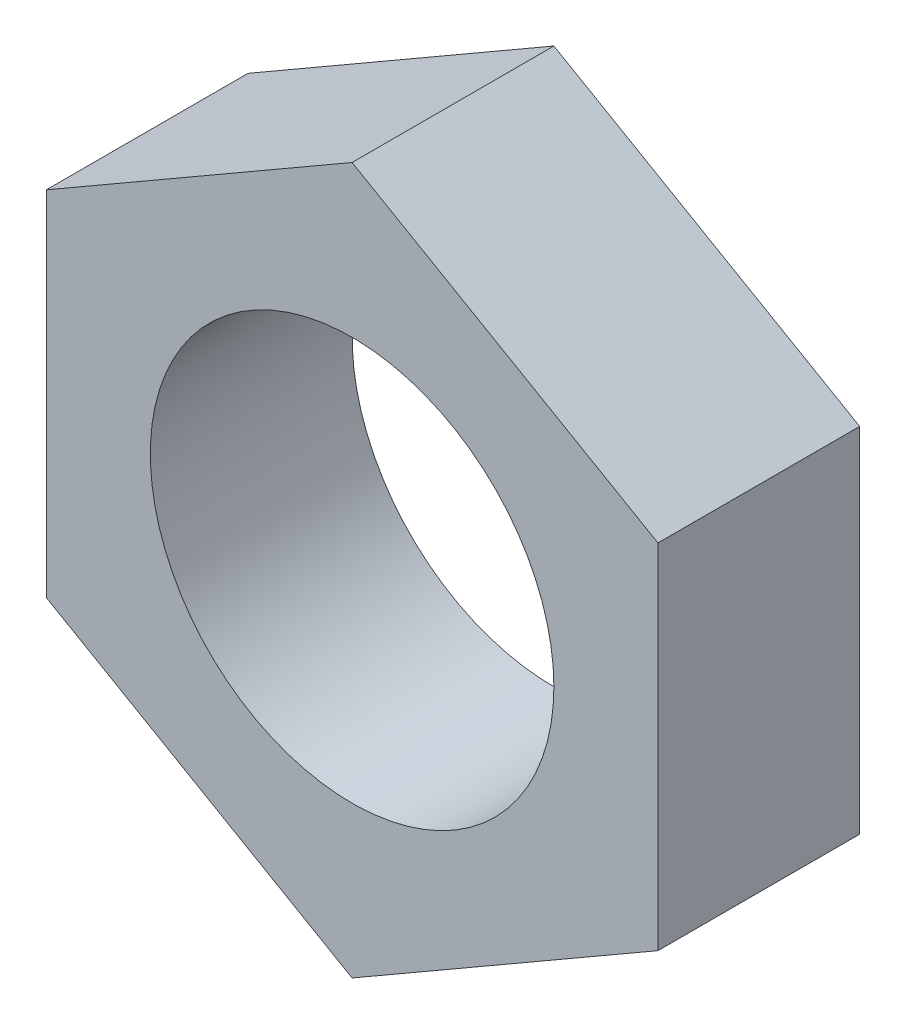
ISO-10303-21;
HEADER;
FILE_DESCRIPTION(('STEP AP214'),'2;1');
FILE_NAME('part.step','',(''),(''),'','','');
FILE_SCHEMA(('AUTOMOTIVE_DESIGN { 1 0 10303 214 1 1 1 1 }'));
ENDSEC;
DATA;
#1=APPLICATION_CONTEXT('core data for automotive mechanical design processes');
#2=APPLICATION_PROTOCOL_DEFINITION('international standard','automotive_design',2000,#1);
#3=PRODUCT_CONTEXT('',#1,'mechanical');
#4=PRODUCT('Part','Part','',(#3));
#5=PRODUCT_RELATED_PRODUCT_CATEGORY('part','',(#4));
#6=PRODUCT_DEFINITION_FORMATION('','',#4);
#7=PRODUCT_DEFINITION_CONTEXT('part definition',#1,'design');
#8=PRODUCT_DEFINITION('design','',#6,#7);
#9=PRODUCT_DEFINITION_SHAPE('','',#8);
#10=(LENGTH_UNIT() NAMED_UNIT(*) SI_UNIT(.MILLI.,.METRE.));
#11=(NAMED_UNIT(*) PLANE_ANGLE_UNIT() SI_UNIT($,.RADIAN.));
#12=(NAMED_UNIT(*) SI_UNIT($,.STERADIAN.) SOLID_ANGLE_UNIT());
#13=UNCERTAINTY_MEASURE_WITH_UNIT(LENGTH_MEASURE(1.E-05),#10,'distance_accuracy_value','');
#14=(GEOMETRIC_REPRESENTATION_CONTEXT(3) GLOBAL_UNCERTAINTY_ASSIGNED_CONTEXT((#13)) GLOBAL_UNIT_ASSIGNED_CONTEXT((#10,
#11,#12)) REPRESENTATION_CONTEXT('',''));
#15=CARTESIAN_POINT('',(0.,0.,0.));
#16=DIRECTION('',(0.,0.,1.));
#17=DIRECTION('',(1.,0.,0.));
#18=AXIS2_PLACEMENT_3D('',#15,#16,#17);
#19=CARTESIAN_POINT('',(0.,0.,2.));
#20=DIRECTION('',(0.,0.,1.));
#21=DIRECTION('',(1.,0.,0.));
#22=AXIS2_PLACEMENT_3D('',#19,#20,#21);
#23=PLANE('',#22);
#24=DIRECTION('',(-0.866025403784439,-0.5,0.));
#25=VECTOR('',#24,1.);
#26=CARTESIAN_POINT('',(0.,3.5,2.));
#27=LINE('',#26,#25);
#28=CARTESIAN_POINT('',(0.,3.5,2.));
#29=VERTEX_POINT('',#28);
#30=CARTESIAN_POINT('',(-3.03108891324554,1.75,2.));
#31=VERTEX_POINT('',#30);
#32=EDGE_CURVE('E128',#29,#31,#27,.T.);
#33=ORIENTED_EDGE('',*,*,#32,.T.);
#34=DIRECTION('',(0.,-1.,0.));
#35=VECTOR('',#34,1.);
#36=CARTESIAN_POINT('',(-3.03108891324554,1.75,2.));
#37=LINE('',#36,#35);
#38=CARTESIAN_POINT('',(-3.03108891324554,-1.75,2.));
#39=VERTEX_POINT('',#38);
#40=EDGE_CURVE('E86',#31,#39,#37,.T.);
#41=ORIENTED_EDGE('',*,*,#40,.T.);
#42=DIRECTION('',(0.866025403784438,-0.5,0.));
#43=VECTOR('',#42,1.);
#44=CARTESIAN_POINT('',(-3.03108891324554,-1.75,2.));
#45=LINE('',#44,#43);
#46=CARTESIAN_POINT('',(0.,-3.5,2.));
#47=VERTEX_POINT('',#46);
#48=EDGE_CURVE('E99',#39,#47,#45,.T.);
#49=ORIENTED_EDGE('',*,*,#48,.T.);
#50=DIRECTION('',(0.866025403784439,0.5,0.));
#51=VECTOR('',#50,1.);
#52=CARTESIAN_POINT('',(0.,-3.5,2.));
#53=LINE('',#52,#51);
#54=CARTESIAN_POINT('',(3.03108891324554,-1.75,2.));
#55=VERTEX_POINT('',#54);
#56=EDGE_CURVE('E93',#47,#55,#53,.T.);
#57=ORIENTED_EDGE('',*,*,#56,.T.);
#58=DIRECTION('',(0.,1.,0.));
#59=VECTOR('',#58,1.);
#60=CARTESIAN_POINT('',(3.03108891324554,-1.75,2.));
#61=LINE('',#60,#59);
#62=CARTESIAN_POINT('',(3.03108891324553,1.75,2.));
#63=VERTEX_POINT('',#62);
#64=EDGE_CURVE('E97',#55,#63,#61,.T.);
#65=ORIENTED_EDGE('',*,*,#64,.T.);
#66=DIRECTION('',(-0.866025403784439,0.5,0.));
#67=VECTOR('',#66,1.);
#68=CARTESIAN_POINT('',(3.03108891324553,1.75,2.));
#69=LINE('',#68,#67);
#70=EDGE_CURVE('E49',#63,#29,#69,.T.);
#71=ORIENTED_EDGE('',*,*,#70,.T.);
#72=EDGE_LOOP('',(#33,#41,#49,#57,#65,#71));
#73=FACE_BOUND('',#72,.T.);
#74=CARTESIAN_POINT('',(0.,0.,2.));
#75=DIRECTION('',(0.,0.,1.));
#76=DIRECTION('',(1.,0.,0.));
#77=AXIS2_PLACEMENT_3D('',#74,#75,#76);
#78=CIRCLE('',#77,2.);
#79=CARTESIAN_POINT('',(2.,0.,2.));
#80=VERTEX_POINT('',#79);
#81=EDGE_CURVE('E121',#80,#80,#78,.T.);
#82=ORIENTED_EDGE('',*,*,#81,.F.);
#83=EDGE_LOOP('',(#82));
#84=FACE_BOUND('',#83,.T.);
#85=ADVANCED_FACE('F32',(#73,#84),#23,.T.);
#86=CARTESIAN_POINT('',(0.,0.,0.));
#87=DIRECTION('',(0.,0.,1.));
#88=DIRECTION('',(1.,0.,0.));
#89=AXIS2_PLACEMENT_3D('',#86,#87,#88);
#90=PLANE('',#89);
#91=DIRECTION('',(-0.866025403784439,-0.5,0.));
#92=VECTOR('',#91,1.);
#93=CARTESIAN_POINT('',(0.,3.5,0.));
#94=LINE('',#93,#92);
#95=CARTESIAN_POINT('',(0.,3.5,0.));
#96=VERTEX_POINT('',#95);
#97=CARTESIAN_POINT('',(-3.03108891324554,1.75,0.));
#98=VERTEX_POINT('',#97);
#99=EDGE_CURVE('E117',#96,#98,#94,.T.);
#100=ORIENTED_EDGE('',*,*,#99,.F.);
#101=DIRECTION('',(-0.866025403784439,0.5,0.));
#102=VECTOR('',#101,1.);
#103=CARTESIAN_POINT('',(3.03108891324553,1.75,0.));
#104=LINE('',#103,#102);
#105=CARTESIAN_POINT('',(3.03108891324553,1.75,0.));
#106=VERTEX_POINT('',#105);
#107=EDGE_CURVE('E78',#106,#96,#104,.T.);
#108=ORIENTED_EDGE('',*,*,#107,.F.);
#109=DIRECTION('',(0.,1.,0.));
#110=VECTOR('',#109,1.);
#111=CARTESIAN_POINT('',(3.03108891324554,-1.75,0.));
#112=LINE('',#111,#110);
#113=CARTESIAN_POINT('',(3.03108891324554,-1.75,0.));
#114=VERTEX_POINT('',#113);
#115=EDGE_CURVE('E72',#114,#106,#112,.T.);
#116=ORIENTED_EDGE('',*,*,#115,.F.);
#117=DIRECTION('',(0.866025403784439,0.5,0.));
#118=VECTOR('',#117,1.);
#119=CARTESIAN_POINT('',(0.,-3.5,0.));
#120=LINE('',#119,#118);
#121=CARTESIAN_POINT('',(0.,-3.5,0.));
#122=VERTEX_POINT('',#121);
#123=EDGE_CURVE('E107',#122,#114,#120,.T.);
#124=ORIENTED_EDGE('',*,*,#123,.F.);
#125=DIRECTION('',(0.866025403784438,-0.5,0.));
#126=VECTOR('',#125,1.);
#127=CARTESIAN_POINT('',(-3.03108891324554,-1.75,0.));
#128=LINE('',#127,#126);
#129=CARTESIAN_POINT('',(-3.03108891324554,-1.75,0.));
#130=VERTEX_POINT('',#129);
#131=EDGE_CURVE('E123',#130,#122,#128,.T.);
#132=ORIENTED_EDGE('',*,*,#131,.F.);
#133=DIRECTION('',(0.,-1.,0.));
#134=VECTOR('',#133,1.);
#135=CARTESIAN_POINT('',(-3.03108891324554,1.75,0.));
#136=LINE('',#135,#134);
#137=EDGE_CURVE('E120',#98,#130,#136,.T.);
#138=ORIENTED_EDGE('',*,*,#137,.F.);
#139=EDGE_LOOP('',(#100,#108,#116,#124,#132,#138));
#140=FACE_BOUND('',#139,.T.);
#141=CARTESIAN_POINT('',(0.,0.,0.));
#142=DIRECTION('',(0.,0.,1.));
#143=DIRECTION('',(1.,0.,0.));
#144=AXIS2_PLACEMENT_3D('',#141,#142,#143);
#145=CIRCLE('',#144,2.);
#146=CARTESIAN_POINT('',(2.,0.,0.));
#147=VERTEX_POINT('',#146);
#148=EDGE_CURVE('E221',#147,#147,#145,.T.);
#149=ORIENTED_EDGE('',*,*,#148,.T.);
#150=EDGE_LOOP('',(#149));
#151=FACE_BOUND('',#150,.T.);
#152=ADVANCED_FACE('F137',(#140,#151),#90,.F.);
#153=CARTESIAN_POINT('',(0.,3.5,2.));
#154=DIRECTION('',(0.5,-0.866025403784439,0.));
#155=DIRECTION('',(0.866025403784439,0.5,0.));
#156=AXIS2_PLACEMENT_3D('',#153,#154,#155);
#157=PLANE('',#156);
#158=ORIENTED_EDGE('',*,*,#99,.T.);
#159=DIRECTION('',(0.,0.,-1.));
#160=VECTOR('',#159,1.);
#161=CARTESIAN_POINT('',(-3.03108891324554,1.75,2.));
#162=LINE('',#161,#160);
#163=EDGE_CURVE('E11',#31,#98,#162,.T.);
#164=ORIENTED_EDGE('',*,*,#163,.F.);
#165=ORIENTED_EDGE('',*,*,#32,.F.);
#166=DIRECTION('',(0.,0.,-1.));
#167=VECTOR('',#166,1.);
#168=CARTESIAN_POINT('',(0.,3.5,2.));
#169=LINE('',#168,#167);
#170=EDGE_CURVE('E113',#29,#96,#169,.T.);
#171=ORIENTED_EDGE('',*,*,#170,.T.);
#172=EDGE_LOOP('',(#158,#164,#165,#171));
#173=FACE_BOUND('',#172,.T.);
#174=ADVANCED_FACE('F34',(#173),#157,.F.);
#175=CARTESIAN_POINT('',(-3.03108891324554,1.75,2.));
#176=DIRECTION('',(1.,0.,0.));
#177=DIRECTION('',(0.,0.,-1.));
#178=AXIS2_PLACEMENT_3D('',#175,#176,#177);
#179=PLANE('',#178);
#180=ORIENTED_EDGE('',*,*,#137,.T.);
#181=DIRECTION('',(0.,0.,-1.));
#182=VECTOR('',#181,1.);
#183=CARTESIAN_POINT('',(-3.03108891324554,-1.75,2.));
#184=LINE('',#183,#182);
#185=EDGE_CURVE('E41',#39,#130,#184,.T.);
#186=ORIENTED_EDGE('',*,*,#185,.F.);
#187=ORIENTED_EDGE('',*,*,#40,.F.);
#188=ORIENTED_EDGE('',*,*,#163,.T.);
#189=EDGE_LOOP('',(#180,#186,#187,#188));
#190=FACE_BOUND('',#189,.T.);
#191=ADVANCED_FACE('F162',(#190),#179,.F.);
#192=CARTESIAN_POINT('',(-3.03108891324554,-1.75,2.));
#193=DIRECTION('',(0.5,0.866025403784438,0.));
#194=DIRECTION('',(-0.866025403784439,0.5,0.));
#195=AXIS2_PLACEMENT_3D('',#192,#193,#194);
#196=PLANE('',#195);
#197=ORIENTED_EDGE('',*,*,#131,.T.);
#198=DIRECTION('',(0.,0.,-1.));
#199=VECTOR('',#198,1.);
#200=CARTESIAN_POINT('',(0.,-3.5,2.));
#201=LINE('',#200,#199);
#202=EDGE_CURVE('E108',#47,#122,#201,.T.);
#203=ORIENTED_EDGE('',*,*,#202,.F.);
#204=ORIENTED_EDGE('',*,*,#48,.F.);
#205=ORIENTED_EDGE('',*,*,#185,.T.);
#206=EDGE_LOOP('',(#197,#203,#204,#205));
#207=FACE_BOUND('',#206,.T.);
#208=ADVANCED_FACE('F134',(#207),#196,.F.);
#209=CARTESIAN_POINT('',(0.,-3.5,2.));
#210=DIRECTION('',(-0.5,0.866025403784439,0.));
#211=DIRECTION('',(-0.866025403784439,-0.5,0.));
#212=AXIS2_PLACEMENT_3D('',#209,#210,#211);
#213=PLANE('',#212);
#214=ORIENTED_EDGE('',*,*,#123,.T.);
#215=DIRECTION('',(0.,0.,-1.));
#216=VECTOR('',#215,1.);
#217=CARTESIAN_POINT('',(3.03108891324554,-1.75,2.));
#218=LINE('',#217,#216);
#219=EDGE_CURVE('E104',#55,#114,#218,.T.);
#220=ORIENTED_EDGE('',*,*,#219,.F.);
#221=ORIENTED_EDGE('',*,*,#56,.F.);
#222=ORIENTED_EDGE('',*,*,#202,.T.);
#223=EDGE_LOOP('',(#214,#220,#221,#222));
#224=FACE_BOUND('',#223,.T.);
#225=ADVANCED_FACE('F105',(#224),#213,.F.);
#226=CARTESIAN_POINT('',(3.03108891324554,-1.75,2.));
#227=DIRECTION('',(-1.,0.,0.));
#228=DIRECTION('',(0.,-1.,0.));
#229=AXIS2_PLACEMENT_3D('',#226,#227,#228);
#230=PLANE('',#229);
#231=ORIENTED_EDGE('',*,*,#115,.T.);
#232=DIRECTION('',(0.,0.,-1.));
#233=VECTOR('',#232,1.);
#234=CARTESIAN_POINT('',(3.03108891324553,1.75,2.));
#235=LINE('',#234,#233);
#236=EDGE_CURVE('E109',#63,#106,#235,.T.);
#237=ORIENTED_EDGE('',*,*,#236,.F.);
#238=ORIENTED_EDGE('',*,*,#64,.F.);
#239=ORIENTED_EDGE('',*,*,#219,.T.);
#240=EDGE_LOOP('',(#231,#237,#238,#239));
#241=FACE_BOUND('',#240,.T.);
#242=ADVANCED_FACE('F111',(#241),#230,.F.);
#243=CARTESIAN_POINT('',(3.03108891324553,1.75,2.));
#244=DIRECTION('',(-0.5,-0.866025403784439,0.));
#245=DIRECTION('',(0.866025403784439,-0.5,0.));
#246=AXIS2_PLACEMENT_3D('',#243,#244,#245);
#247=PLANE('',#246);
#248=ORIENTED_EDGE('',*,*,#107,.T.);
#249=ORIENTED_EDGE('',*,*,#170,.F.);
#250=ORIENTED_EDGE('',*,*,#70,.F.);
#251=ORIENTED_EDGE('',*,*,#236,.T.);
#252=EDGE_LOOP('',(#248,#249,#250,#251));
#253=FACE_BOUND('',#252,.T.);
#254=ADVANCED_FACE('F142',(#253),#247,.F.);
#255=CARTESIAN_POINT('',(0.,0.,2.));
#256=DIRECTION('',(0.,0.,-1.));
#257=DIRECTION('',(-1.,0.,0.));
#258=AXIS2_PLACEMENT_3D('',#255,#256,#257);
#259=CYLINDRICAL_SURFACE('',#258,2.);
#260=ORIENTED_EDGE('',*,*,#81,.T.);
#261=EDGE_LOOP('',(#260));
#262=FACE_BOUND('',#261,.T.);
#263=ORIENTED_EDGE('',*,*,#148,.F.);
#264=EDGE_LOOP('',(#263));
#265=FACE_BOUND('',#264,.T.);
#266=ADVANCED_FACE('F144',(#262,#265),#259,.F.);
#267=CLOSED_SHELL('',(#85,#152,#174,#191,#208,#225,#242,#254,#266));
#268=MANIFOLD_SOLID_BREP('B2',#267);
#269=ADVANCED_BREP_SHAPE_REPRESENTATION('',(#18,#268),#14);
#270=SHAPE_DEFINITION_REPRESENTATION(#9,#269);
ENDSEC;
END-ISO-10303-21;
